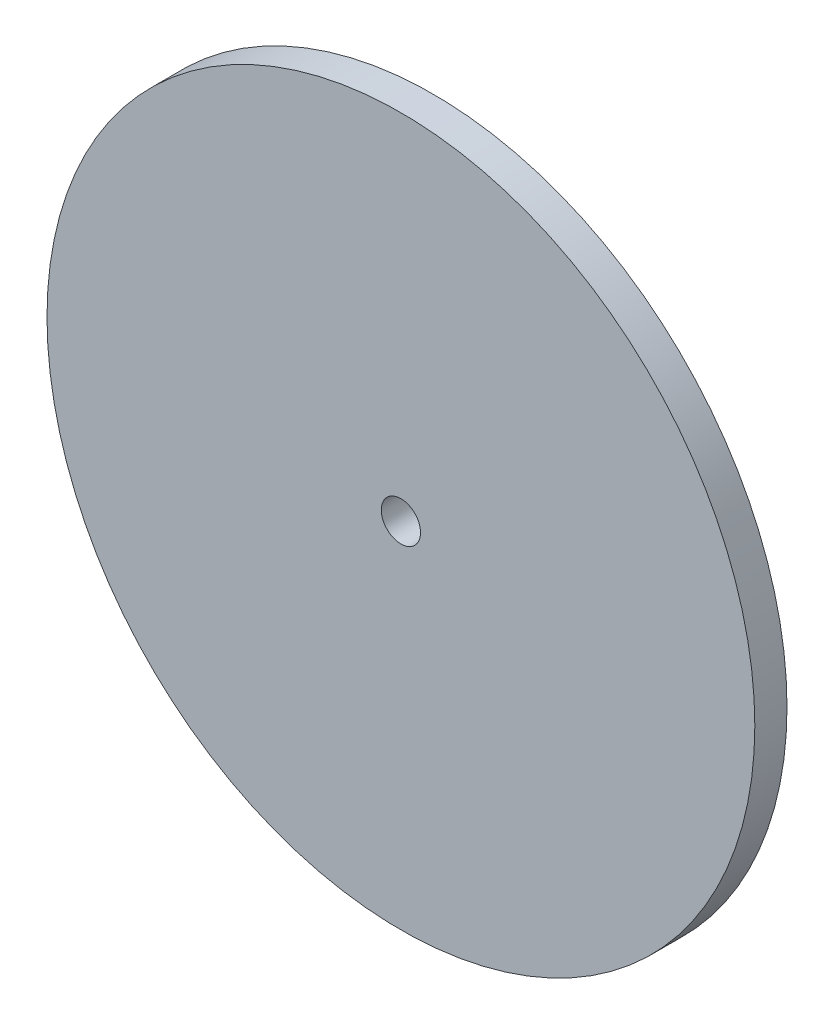
ISO-10303-21;
HEADER;
FILE_DESCRIPTION(('STEP AP214'),'2;1');
FILE_NAME('part.step','',(''),(''),'','','');
FILE_SCHEMA(('AUTOMOTIVE_DESIGN { 1 0 10303 214 1 1 1 1 }'));
ENDSEC;
DATA;
#1=APPLICATION_CONTEXT('core data for automotive mechanical design processes');
#2=APPLICATION_PROTOCOL_DEFINITION('international standard','automotive_design',2000,#1);
#3=PRODUCT_CONTEXT('',#1,'mechanical');
#4=PRODUCT('Part','Part','',(#3));
#5=PRODUCT_RELATED_PRODUCT_CATEGORY('part','',(#4));
#6=PRODUCT_DEFINITION_FORMATION('','',#4);
#7=PRODUCT_DEFINITION_CONTEXT('part definition',#1,'design');
#8=PRODUCT_DEFINITION('design','',#6,#7);
#9=PRODUCT_DEFINITION_SHAPE('','',#8);
#10=(LENGTH_UNIT() NAMED_UNIT(*) SI_UNIT(.MILLI.,.METRE.));
#11=(NAMED_UNIT(*) PLANE_ANGLE_UNIT() SI_UNIT($,.RADIAN.));
#12=(NAMED_UNIT(*) SI_UNIT($,.STERADIAN.) SOLID_ANGLE_UNIT());
#13=UNCERTAINTY_MEASURE_WITH_UNIT(LENGTH_MEASURE(1.E-05),#10,'distance_accuracy_value','');
#14=(GEOMETRIC_REPRESENTATION_CONTEXT(3) GLOBAL_UNCERTAINTY_ASSIGNED_CONTEXT((#13)) GLOBAL_UNIT_ASSIGNED_CONTEXT((#10,
#11,#12)) REPRESENTATION_CONTEXT('',''));
#15=CARTESIAN_POINT('',(0.,0.,0.));
#16=DIRECTION('',(0.,0.,1.));
#17=DIRECTION('',(1.,0.,0.));
#18=AXIS2_PLACEMENT_3D('',#15,#16,#17);
#19=CARTESIAN_POINT('',(0.,0.,5.));
#20=DIRECTION('',(0.,0.,1.));
#21=DIRECTION('',(1.,0.,0.));
#22=AXIS2_PLACEMENT_3D('',#19,#20,#21);
#23=PLANE('',#22);
#24=CARTESIAN_POINT('',(0.,0.,5.));
#25=DIRECTION('',(0.,0.,1.));
#26=DIRECTION('',(1.,0.,0.));
#27=AXIS2_PLACEMENT_3D('',#24,#25,#26);
#28=CIRCLE('',#27,55.);
#29=CARTESIAN_POINT('',(55.,0.,5.));
#30=VERTEX_POINT('',#29);
#31=EDGE_CURVE('E10',#30,#30,#28,.T.);
#32=ORIENTED_EDGE('',*,*,#31,.T.);
#33=EDGE_LOOP('',(#32));
#34=FACE_BOUND('',#33,.T.);
#35=CARTESIAN_POINT('',(0.,0.,5.));
#36=DIRECTION('',(0.,0.,1.));
#37=DIRECTION('',(1.,0.,0.));
#38=AXIS2_PLACEMENT_3D('',#35,#36,#37);
#39=CIRCLE('',#38,3.05);
#40=CARTESIAN_POINT('',(3.05,0.,5.));
#41=VERTEX_POINT('',#40);
#42=EDGE_CURVE('E52',#41,#41,#39,.T.);
#43=ORIENTED_EDGE('',*,*,#42,.F.);
#44=EDGE_LOOP('',(#43));
#45=FACE_BOUND('',#44,.T.);
#46=ADVANCED_FACE('F38',(#34,#45),#23,.T.);
#47=CARTESIAN_POINT('',(0.,0.,0.));
#48=DIRECTION('',(0.,0.,1.));
#49=DIRECTION('',(1.,0.,0.));
#50=AXIS2_PLACEMENT_3D('',#47,#48,#49);
#51=PLANE('',#50);
#52=CARTESIAN_POINT('',(0.,0.,0.));
#53=DIRECTION('',(0.,0.,1.));
#54=DIRECTION('',(1.,0.,0.));
#55=AXIS2_PLACEMENT_3D('',#52,#53,#54);
#56=CIRCLE('',#55,55.);
#57=CARTESIAN_POINT('',(55.,0.,0.));
#58=VERTEX_POINT('',#57);
#59=EDGE_CURVE('E42',#58,#58,#56,.T.);
#60=ORIENTED_EDGE('',*,*,#59,.F.);
#61=EDGE_LOOP('',(#60));
#62=FACE_BOUND('',#61,.T.);
#63=CARTESIAN_POINT('',(0.,0.,0.));
#64=DIRECTION('',(0.,0.,1.));
#65=DIRECTION('',(1.,0.,0.));
#66=AXIS2_PLACEMENT_3D('',#63,#64,#65);
#67=CIRCLE('',#66,3.05);
#68=CARTESIAN_POINT('',(3.05,0.,0.));
#69=VERTEX_POINT('',#68);
#70=EDGE_CURVE('E54',#69,#69,#67,.T.);
#71=ORIENTED_EDGE('',*,*,#70,.T.);
#72=EDGE_LOOP('',(#71));
#73=FACE_BOUND('',#72,.T.);
#74=ADVANCED_FACE('F67',(#62,#73),#51,.F.);
#75=CARTESIAN_POINT('',(0.,0.,5.));
#76=DIRECTION('',(0.,0.,-1.));
#77=DIRECTION('',(-1.,0.,0.));
#78=AXIS2_PLACEMENT_3D('',#75,#76,#77);
#79=CYLINDRICAL_SURFACE('',#78,55.);
#80=ORIENTED_EDGE('',*,*,#31,.F.);
#81=EDGE_LOOP('',(#80));
#82=FACE_BOUND('',#81,.T.);
#83=ORIENTED_EDGE('',*,*,#59,.T.);
#84=EDGE_LOOP('',(#83));
#85=FACE_BOUND('',#84,.T.);
#86=ADVANCED_FACE('F40',(#82,#85),#79,.T.);
#87=CARTESIAN_POINT('',(0.,0.,5.));
#88=DIRECTION('',(0.,0.,-1.));
#89=DIRECTION('',(-1.,0.,0.));
#90=AXIS2_PLACEMENT_3D('',#87,#88,#89);
#91=CYLINDRICAL_SURFACE('',#90,3.05);
#92=ORIENTED_EDGE('',*,*,#42,.T.);
#93=EDGE_LOOP('',(#92));
#94=FACE_BOUND('',#93,.T.);
#95=ORIENTED_EDGE('',*,*,#70,.F.);
#96=EDGE_LOOP('',(#95));
#97=FACE_BOUND('',#96,.T.);
#98=ADVANCED_FACE('F63',(#94,#97),#91,.F.);
#99=CLOSED_SHELL('',(#46,#74,#86,#98));
#100=MANIFOLD_SOLID_BREP('B2',#99);
#101=ADVANCED_BREP_SHAPE_REPRESENTATION('',(#18,#100),#14);
#102=SHAPE_DEFINITION_REPRESENTATION(#9,#101);
ENDSEC;
END-ISO-10303-21;
